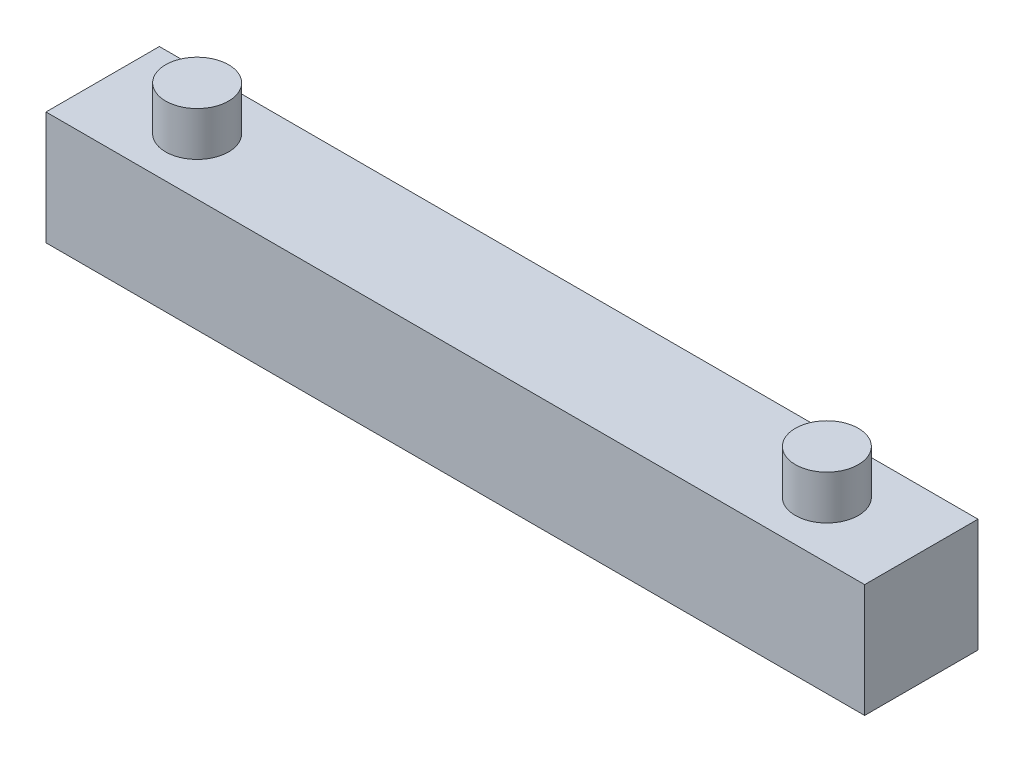
ISO-10303-21;
HEADER;
FILE_DESCRIPTION(('STEP AP214'),'2;1');
FILE_NAME('part.step','',(''),(''),'','','');
FILE_SCHEMA(('AUTOMOTIVE_DESIGN { 1 0 10303 214 1 1 1 1 }'));
ENDSEC;
DATA;
#1=APPLICATION_CONTEXT('core data for automotive mechanical design processes');
#2=APPLICATION_PROTOCOL_DEFINITION('international standard','automotive_design',2000,#1);
#3=PRODUCT_CONTEXT('',#1,'mechanical');
#4=PRODUCT('Part','Part','',(#3));
#5=PRODUCT_RELATED_PRODUCT_CATEGORY('part','',(#4));
#6=PRODUCT_DEFINITION_FORMATION('','',#4);
#7=PRODUCT_DEFINITION_CONTEXT('part definition',#1,'design');
#8=PRODUCT_DEFINITION('design','',#6,#7);
#9=PRODUCT_DEFINITION_SHAPE('','',#8);
#10=(LENGTH_UNIT() NAMED_UNIT(*) SI_UNIT(.MILLI.,.METRE.));
#11=(NAMED_UNIT(*) PLANE_ANGLE_UNIT() SI_UNIT($,.RADIAN.));
#12=(NAMED_UNIT(*) SI_UNIT($,.STERADIAN.) SOLID_ANGLE_UNIT());
#13=UNCERTAINTY_MEASURE_WITH_UNIT(LENGTH_MEASURE(1.E-05),#10,'distance_accuracy_value','');
#14=(GEOMETRIC_REPRESENTATION_CONTEXT(3) GLOBAL_UNCERTAINTY_ASSIGNED_CONTEXT((#13)) GLOBAL_UNIT_ASSIGNED_CONTEXT((#10,
#11,#12)) REPRESENTATION_CONTEXT('',''));
#15=CARTESIAN_POINT('',(0.,0.,0.));
#16=DIRECTION('',(0.,0.,1.));
#17=DIRECTION('',(1.,0.,0.));
#18=AXIS2_PLACEMENT_3D('',#15,#16,#17);
#19=CARTESIAN_POINT('',(0.,9.,0.));
#20=DIRECTION('',(1.,0.,0.));
#21=DIRECTION('',(0.,0.,-1.));
#22=AXIS2_PLACEMENT_3D('',#19,#20,#21);
#23=PLANE('',#22);
#24=DIRECTION('',(0.,0.,1.));
#25=VECTOR('',#24,1.);
#26=CARTESIAN_POINT('',(0.,0.,0.));
#27=LINE('',#26,#25);
#28=CARTESIAN_POINT('',(0.,0.,0.));
#29=VERTEX_POINT('',#28);
#30=CARTESIAN_POINT('',(0.,0.,9.));
#31=VERTEX_POINT('',#30);
#32=EDGE_CURVE('E98',#29,#31,#27,.T.);
#33=ORIENTED_EDGE('',*,*,#32,.T.);
#34=DIRECTION('',(0.,-1.,0.));
#35=VECTOR('',#34,1.);
#36=CARTESIAN_POINT('',(0.,9.,9.));
#37=LINE('',#36,#35);
#38=CARTESIAN_POINT('',(0.,9.,9.));
#39=VERTEX_POINT('',#38);
#40=EDGE_CURVE('E11',#39,#31,#37,.T.);
#41=ORIENTED_EDGE('',*,*,#40,.F.);
#42=DIRECTION('',(0.,0.,1.));
#43=VECTOR('',#42,1.);
#44=CARTESIAN_POINT('',(0.,9.,0.));
#45=LINE('',#44,#43);
#46=CARTESIAN_POINT('',(0.,9.,0.));
#47=VERTEX_POINT('',#46);
#48=EDGE_CURVE('E86',#47,#39,#45,.T.);
#49=ORIENTED_EDGE('',*,*,#48,.F.);
#50=DIRECTION('',(0.,-1.,0.));
#51=VECTOR('',#50,1.);
#52=CARTESIAN_POINT('',(0.,9.,0.));
#53=LINE('',#52,#51);
#54=EDGE_CURVE('E94',#47,#29,#53,.T.);
#55=ORIENTED_EDGE('',*,*,#54,.T.);
#56=EDGE_LOOP('',(#33,#41,#49,#55));
#57=FACE_BOUND('',#56,.T.);
#58=ADVANCED_FACE('F35',(#57),#23,.F.);
#59=CARTESIAN_POINT('',(0.,9.,9.));
#60=DIRECTION('',(0.,0.,-1.));
#61=DIRECTION('',(-1.,0.,0.));
#62=AXIS2_PLACEMENT_3D('',#59,#60,#61);
#63=PLANE('',#62);
#64=DIRECTION('',(1.,0.,0.));
#65=VECTOR('',#64,1.);
#66=CARTESIAN_POINT('',(0.,0.,9.));
#67=LINE('',#66,#65);
#68=CARTESIAN_POINT('',(65.,0.,9.));
#69=VERTEX_POINT('',#68);
#70=EDGE_CURVE('E90',#31,#69,#67,.T.);
#71=ORIENTED_EDGE('',*,*,#70,.T.);
#72=DIRECTION('',(0.,-1.,0.));
#73=VECTOR('',#72,1.);
#74=CARTESIAN_POINT('',(65.,9.,9.));
#75=LINE('',#74,#73);
#76=CARTESIAN_POINT('',(65.,9.,9.));
#77=VERTEX_POINT('',#76);
#78=EDGE_CURVE('E43',#77,#69,#75,.T.);
#79=ORIENTED_EDGE('',*,*,#78,.F.);
#80=DIRECTION('',(1.,0.,0.));
#81=VECTOR('',#80,1.);
#82=CARTESIAN_POINT('',(0.,9.,9.));
#83=LINE('',#82,#81);
#84=EDGE_CURVE('E81',#39,#77,#83,.T.);
#85=ORIENTED_EDGE('',*,*,#84,.F.);
#86=ORIENTED_EDGE('',*,*,#40,.T.);
#87=EDGE_LOOP('',(#71,#79,#85,#86));
#88=FACE_BOUND('',#87,.T.);
#89=ADVANCED_FACE('F89',(#88),#63,.F.);
#90=CARTESIAN_POINT('',(65.,9.,0.));
#91=DIRECTION('',(-1.,0.,0.));
#92=DIRECTION('',(0.,0.,1.));
#93=AXIS2_PLACEMENT_3D('',#90,#91,#92);
#94=PLANE('',#93);
#95=DIRECTION('',(0.,0.,-1.));
#96=VECTOR('',#95,1.);
#97=CARTESIAN_POINT('',(65.,0.,0.));
#98=LINE('',#97,#96);
#99=CARTESIAN_POINT('',(65.,0.,0.));
#100=VERTEX_POINT('',#99);
#101=EDGE_CURVE('E68',#69,#100,#98,.T.);
#102=ORIENTED_EDGE('',*,*,#101,.T.);
#103=DIRECTION('',(0.,-1.,0.));
#104=VECTOR('',#103,1.);
#105=CARTESIAN_POINT('',(65.,9.,0.));
#106=LINE('',#105,#104);
#107=CARTESIAN_POINT('',(65.,9.,0.));
#108=VERTEX_POINT('',#107);
#109=EDGE_CURVE('E91',#108,#100,#106,.T.);
#110=ORIENTED_EDGE('',*,*,#109,.F.);
#111=DIRECTION('',(0.,0.,-1.));
#112=VECTOR('',#111,1.);
#113=CARTESIAN_POINT('',(65.,9.,0.));
#114=LINE('',#113,#112);
#115=EDGE_CURVE('E84',#77,#108,#114,.T.);
#116=ORIENTED_EDGE('',*,*,#115,.F.);
#117=ORIENTED_EDGE('',*,*,#78,.T.);
#118=EDGE_LOOP('',(#102,#110,#116,#117));
#119=FACE_BOUND('',#118,.T.);
#120=ADVANCED_FACE('F92',(#119),#94,.F.);
#121=CARTESIAN_POINT('',(0.,9.,0.));
#122=DIRECTION('',(0.,0.,1.));
#123=DIRECTION('',(1.,0.,0.));
#124=AXIS2_PLACEMENT_3D('',#121,#122,#123);
#125=PLANE('',#124);
#126=DIRECTION('',(-1.,0.,0.));
#127=VECTOR('',#126,1.);
#128=CARTESIAN_POINT('',(0.,0.,0.));
#129=LINE('',#128,#127);
#130=EDGE_CURVE('E74',#100,#29,#129,.T.);
#131=ORIENTED_EDGE('',*,*,#130,.T.);
#132=ORIENTED_EDGE('',*,*,#54,.F.);
#133=DIRECTION('',(-1.,0.,0.));
#134=VECTOR('',#133,1.);
#135=CARTESIAN_POINT('',(0.,9.,0.));
#136=LINE('',#135,#134);
#137=EDGE_CURVE('E51',#108,#47,#136,.T.);
#138=ORIENTED_EDGE('',*,*,#137,.F.);
#139=ORIENTED_EDGE('',*,*,#109,.T.);
#140=EDGE_LOOP('',(#131,#132,#138,#139));
#141=FACE_BOUND('',#140,.T.);
#142=ADVANCED_FACE('F106',(#141),#125,.F.);
#143=CARTESIAN_POINT('',(0.,9.,0.));
#144=DIRECTION('',(0.,1.,0.));
#145=DIRECTION('',(0.,0.,1.));
#146=AXIS2_PLACEMENT_3D('',#143,#144,#145);
#147=PLANE('',#146);
#148=CARTESIAN_POINT('',(57.5,9.,4.5));
#149=DIRECTION('',(0.,1.,0.));
#150=DIRECTION('',(0.,0.,1.));
#151=AXIS2_PLACEMENT_3D('',#148,#149,#150);
#152=CIRCLE('',#151,2.5);
#153=CARTESIAN_POINT('',(57.5,9.,7.));
#154=VERTEX_POINT('',#153);
#155=EDGE_CURVE('E118',#154,#154,#152,.T.);
#156=ORIENTED_EDGE('',*,*,#155,.F.);
#157=EDGE_LOOP('',(#156));
#158=FACE_BOUND('',#157,.T.);
#159=CARTESIAN_POINT('',(7.5,9.,4.5));
#160=DIRECTION('',(0.,1.,0.));
#161=DIRECTION('',(0.,0.,1.));
#162=AXIS2_PLACEMENT_3D('',#159,#160,#161);
#163=CIRCLE('',#162,2.5);
#164=CARTESIAN_POINT('',(7.5,9.,7.));
#165=VERTEX_POINT('',#164);
#166=EDGE_CURVE('E112',#165,#165,#163,.T.);
#167=ORIENTED_EDGE('',*,*,#166,.F.);
#168=EDGE_LOOP('',(#167));
#169=FACE_BOUND('',#168,.T.);
#170=ORIENTED_EDGE('',*,*,#48,.T.);
#171=ORIENTED_EDGE('',*,*,#84,.T.);
#172=ORIENTED_EDGE('',*,*,#115,.T.);
#173=ORIENTED_EDGE('',*,*,#137,.T.);
#174=EDGE_LOOP('',(#170,#171,#172,#173));
#175=FACE_BOUND('',#174,.T.);
#176=ADVANCED_FACE('F82',(#158,#169,#175),#147,.T.);
#177=CARTESIAN_POINT('',(0.,0.,0.));
#178=DIRECTION('',(0.,1.,0.));
#179=DIRECTION('',(0.,0.,1.));
#180=AXIS2_PLACEMENT_3D('',#177,#178,#179);
#181=PLANE('',#180);
#182=ORIENTED_EDGE('',*,*,#32,.F.);
#183=ORIENTED_EDGE('',*,*,#130,.F.);
#184=ORIENTED_EDGE('',*,*,#101,.F.);
#185=ORIENTED_EDGE('',*,*,#70,.F.);
#186=EDGE_LOOP('',(#182,#183,#184,#185));
#187=FACE_BOUND('',#186,.T.);
#188=ADVANCED_FACE('F109',(#187),#181,.F.);
#189=CARTESIAN_POINT('',(7.5,12.5,4.5));
#190=DIRECTION('',(0.,-1.,0.));
#191=DIRECTION('',(0.,0.,-1.));
#192=AXIS2_PLACEMENT_3D('',#189,#190,#191);
#193=CYLINDRICAL_SURFACE('',#192,2.5);
#194=CARTESIAN_POINT('',(7.5,12.5,4.5));
#195=DIRECTION('',(0.,1.,0.));
#196=DIRECTION('',(0.,0.,1.));
#197=AXIS2_PLACEMENT_3D('',#194,#195,#196);
#198=CIRCLE('',#197,2.5);
#199=CARTESIAN_POINT('',(7.5,12.5,7.));
#200=VERTEX_POINT('',#199);
#201=EDGE_CURVE('E101',#200,#200,#198,.T.);
#202=ORIENTED_EDGE('',*,*,#201,.F.);
#203=EDGE_LOOP('',(#202));
#204=FACE_BOUND('',#203,.T.);
#205=ORIENTED_EDGE('',*,*,#166,.T.);
#206=EDGE_LOOP('',(#205));
#207=FACE_BOUND('',#206,.T.);
#208=ADVANCED_FACE('F138',(#204,#207),#193,.T.);
#209=CARTESIAN_POINT('',(0.,12.5,0.));
#210=DIRECTION('',(0.,1.,0.));
#211=DIRECTION('',(0.,0.,1.));
#212=AXIS2_PLACEMENT_3D('',#209,#210,#211);
#213=PLANE('',#212);
#214=ORIENTED_EDGE('',*,*,#201,.T.);
#215=EDGE_LOOP('',(#214));
#216=FACE_BOUND('',#215,.T.);
#217=ADVANCED_FACE('F129',(#216),#213,.T.);
#218=CARTESIAN_POINT('',(57.5,12.5,4.5));
#219=DIRECTION('',(0.,-1.,0.));
#220=DIRECTION('',(0.,0.,-1.));
#221=AXIS2_PLACEMENT_3D('',#218,#219,#220);
#222=CYLINDRICAL_SURFACE('',#221,2.5);
#223=CARTESIAN_POINT('',(57.5,12.5,4.5));
#224=DIRECTION('',(0.,1.,0.));
#225=DIRECTION('',(0.,0.,1.));
#226=AXIS2_PLACEMENT_3D('',#223,#224,#225);
#227=CIRCLE('',#226,2.5);
#228=CARTESIAN_POINT('',(57.5,12.5,7.));
#229=VERTEX_POINT('',#228);
#230=EDGE_CURVE('E115',#229,#229,#227,.T.);
#231=ORIENTED_EDGE('',*,*,#230,.F.);
#232=EDGE_LOOP('',(#231));
#233=FACE_BOUND('',#232,.T.);
#234=ORIENTED_EDGE('',*,*,#155,.T.);
#235=EDGE_LOOP('',(#234));
#236=FACE_BOUND('',#235,.T.);
#237=ADVANCED_FACE('F126',(#233,#236),#222,.T.);
#238=CARTESIAN_POINT('',(0.,12.5,0.));
#239=DIRECTION('',(0.,1.,0.));
#240=DIRECTION('',(0.,0.,1.));
#241=AXIS2_PLACEMENT_3D('',#238,#239,#240);
#242=PLANE('',#241);
#243=ORIENTED_EDGE('',*,*,#230,.T.);
#244=EDGE_LOOP('',(#243));
#245=FACE_BOUND('',#244,.T.);
#246=ADVANCED_FACE('F124',(#245),#242,.T.);
#247=CLOSED_SHELL('',(#58,#89,#120,#142,#176,#188,#208,#217,#237,#246));
#248=MANIFOLD_SOLID_BREP('B2',#247);
#249=ADVANCED_BREP_SHAPE_REPRESENTATION('',(#18,#248),#14);
#250=SHAPE_DEFINITION_REPRESENTATION(#9,#249);
ENDSEC;
END-ISO-10303-21;
